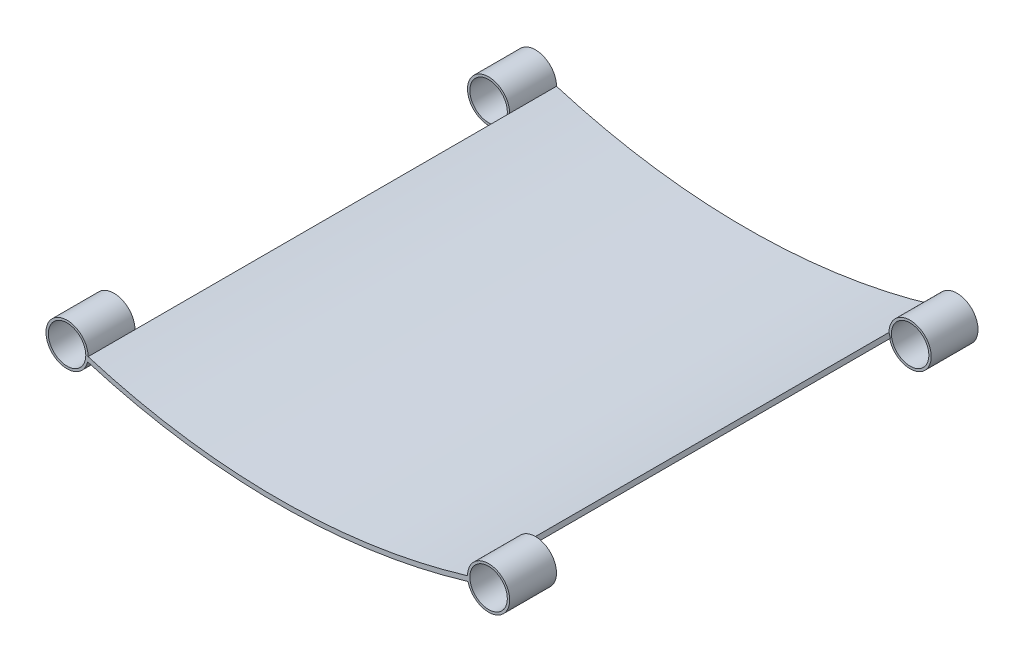
ISO-10303-21;
HEADER;
FILE_DESCRIPTION(('STEP AP214'),'2;1');
FILE_NAME('part.step','',(''),(''),'','','');
FILE_SCHEMA(('AUTOMOTIVE_DESIGN { 1 0 10303 214 1 1 1 1 }'));
ENDSEC;
DATA;
#1=APPLICATION_CONTEXT('core data for automotive mechanical design processes');
#2=APPLICATION_PROTOCOL_DEFINITION('international standard','automotive_design',2000,#1);
#3=PRODUCT_CONTEXT('',#1,'mechanical');
#4=PRODUCT('Part','Part','',(#3));
#5=PRODUCT_RELATED_PRODUCT_CATEGORY('part','',(#4));
#6=PRODUCT_DEFINITION_FORMATION('','',#4);
#7=PRODUCT_DEFINITION_CONTEXT('part definition',#1,'design');
#8=PRODUCT_DEFINITION('design','',#6,#7);
#9=PRODUCT_DEFINITION_SHAPE('','',#8);
#10=(LENGTH_UNIT() NAMED_UNIT(*) SI_UNIT(.MILLI.,.METRE.));
#11=(NAMED_UNIT(*) PLANE_ANGLE_UNIT() SI_UNIT($,.RADIAN.));
#12=(NAMED_UNIT(*) SI_UNIT($,.STERADIAN.) SOLID_ANGLE_UNIT());
#13=UNCERTAINTY_MEASURE_WITH_UNIT(LENGTH_MEASURE(1.E-05),#10,'distance_accuracy_value','');
#14=(GEOMETRIC_REPRESENTATION_CONTEXT(3) GLOBAL_UNCERTAINTY_ASSIGNED_CONTEXT((#13)) GLOBAL_UNIT_ASSIGNED_CONTEXT((#10,
#11,#12)) REPRESENTATION_CONTEXT('',''));
#15=CARTESIAN_POINT('',(0.,0.,0.));
#16=DIRECTION('',(0.,0.,1.));
#17=DIRECTION('',(1.,0.,0.));
#18=AXIS2_PLACEMENT_3D('',#15,#16,#17);
#19=CARTESIAN_POINT('',(40.5,0.,-100.));
#20=DIRECTION('',(-0.957242798620202,-0.289285714285659,0.));
#21=DIRECTION('',(0.289285714285659,-0.957242798620202,0.));
#22=AXIS2_PLACEMENT_3D('',#19,#20,#21);
#23=PLANE('',#22);
#24=DIRECTION('',(0.289285714285659,-0.957242798620202,0.));
#25=VECTOR('',#24,1.);
#26=CARTESIAN_POINT('',(40.5,0.,-90.));
#27=LINE('',#26,#25);
#28=CARTESIAN_POINT('',(40.5,0.,-90.));
#29=VERTEX_POINT('',#28);
#30=CARTESIAN_POINT('',(40.7892857142857,-0.957242798620195,-90.));
#31=VERTEX_POINT('',#30);
#32=EDGE_CURVE('E135',#29,#31,#27,.T.);
#33=ORIENTED_EDGE('',*,*,#32,.F.);
#34=DIRECTION('',(0.,0.,1.));
#35=VECTOR('',#34,1.);
#36=CARTESIAN_POINT('',(40.5,0.,-100.));
#37=LINE('',#36,#35);
#38=CARTESIAN_POINT('',(40.5,0.,-9.99999999999999));
#39=VERTEX_POINT('',#38);
#40=EDGE_CURVE('E120',#29,#39,#37,.T.);
#41=ORIENTED_EDGE('',*,*,#40,.T.);
#42=DIRECTION('',(-0.289285714285659,0.957242798620202,0.));
#43=VECTOR('',#42,1.);
#44=CARTESIAN_POINT('',(40.5,0.,-9.99999999999999));
#45=LINE('',#44,#43);
#46=CARTESIAN_POINT('',(40.7892857142857,-0.957242798620195,-9.99999999999999));
#47=VERTEX_POINT('',#46);
#48=EDGE_CURVE('E214',#47,#39,#45,.T.);
#49=ORIENTED_EDGE('',*,*,#48,.F.);
#50=DIRECTION('',(0.,0.,1.));
#51=VECTOR('',#50,1.);
#52=CARTESIAN_POINT('',(40.7892857142857,-0.957242798620195,-100.));
#53=LINE('',#52,#51);
#54=EDGE_CURVE('E136',#31,#47,#53,.T.);
#55=ORIENTED_EDGE('',*,*,#54,.F.);
#56=EDGE_LOOP('',(#33,#41,#49,#55));
#57=FACE_BOUND('',#56,.T.);
#58=ADVANCED_FACE('F45',(#57),#23,.F.);
#59=CARTESIAN_POINT('',(-40.5,0.,-100.));
#60=DIRECTION('',(-0.957242798620186,0.289285714285711,0.));
#61=DIRECTION('',(-0.289285714285711,-0.957242798620186,0.));
#62=AXIS2_PLACEMENT_3D('',#59,#60,#61);
#63=PLANE('',#62);
#64=DIRECTION('',(0.,0.,1.));
#65=VECTOR('',#64,1.);
#66=CARTESIAN_POINT('',(-40.4999999999999,0.,-100.));
#67=LINE('',#66,#65);
#68=CARTESIAN_POINT('',(-40.4999999999999,0.,-90.));
#69=VERTEX_POINT('',#68);
#70=CARTESIAN_POINT('',(-40.4999999999999,0.,-9.99999999999999));
#71=VERTEX_POINT('',#70);
#72=EDGE_CURVE('E238',#69,#71,#67,.T.);
#73=ORIENTED_EDGE('',*,*,#72,.F.);
#74=DIRECTION('',(-0.289285714285711,-0.957242798620186,0.));
#75=VECTOR('',#74,1.);
#76=CARTESIAN_POINT('',(-40.5,0.,-90.));
#77=LINE('',#76,#75);
#78=CARTESIAN_POINT('',(-40.7892857142857,-0.957242798620195,-90.));
#79=VERTEX_POINT('',#78);
#80=EDGE_CURVE('E190',#69,#79,#77,.T.);
#81=ORIENTED_EDGE('',*,*,#80,.T.);
#82=DIRECTION('',(0.,0.,1.));
#83=VECTOR('',#82,1.);
#84=CARTESIAN_POINT('',(-40.7892857142857,-0.957242798620195,-100.));
#85=LINE('',#84,#83);
#86=CARTESIAN_POINT('',(-40.7892857142857,-0.957242798620195,-10.));
#87=VERTEX_POINT('',#86);
#88=EDGE_CURVE('E237',#79,#87,#85,.T.);
#89=ORIENTED_EDGE('',*,*,#88,.T.);
#90=DIRECTION('',(-0.289285714285711,-0.957242798620186,0.));
#91=VECTOR('',#90,1.);
#92=CARTESIAN_POINT('',(-40.8765880102041,-1.24612500034662,-10.));
#93=LINE('',#92,#91);
#94=EDGE_CURVE('E243',#71,#87,#93,.T.);
#95=ORIENTED_EDGE('',*,*,#94,.F.);
#96=EDGE_LOOP('',(#73,#81,#89,#95));
#97=FACE_BOUND('',#96,.T.);
#98=ADVANCED_FACE('F292',(#97),#63,.T.);
#99=CARTESIAN_POINT('',(-45.,0.,-10.));
#100=DIRECTION('',(0.,0.,1.));
#101=DIRECTION('',(1.,0.,0.));
#102=AXIS2_PLACEMENT_3D('',#99,#100,#101);
#103=CYLINDRICAL_SURFACE('',#102,4.5);
#104=CARTESIAN_POINT('',(-45.,0.,-10.));
#105=DIRECTION('',(0.,0.,1.));
#106=DIRECTION('',(1.,0.,0.));
#107=AXIS2_PLACEMENT_3D('',#104,#105,#106);
#108=CIRCLE('',#107,4.5);
#109=CARTESIAN_POINT('',(-40.6147762521767,-1.00985775311525,-10.));
#110=VERTEX_POINT('',#109);
#111=EDGE_CURVE('E11',#71,#110,#108,.T.);
#112=ORIENTED_EDGE('',*,*,#111,.T.);
#113=DIRECTION('',(0.,0.,1.));
#114=VECTOR('',#113,1.);
#115=CARTESIAN_POINT('',(-40.6147762521767,-1.00985775311527,-50.));
#116=LINE('',#115,#114);
#117=CARTESIAN_POINT('',(-40.6147762521767,-1.00985775311527,0.));
#118=VERTEX_POINT('',#117);
#119=EDGE_CURVE('E251',#110,#118,#116,.T.);
#120=ORIENTED_EDGE('',*,*,#119,.T.);
#121=CARTESIAN_POINT('',(-45.,0.,0.));
#122=DIRECTION('',(0.,0.,1.));
#123=DIRECTION('',(1.,0.,0.));
#124=AXIS2_PLACEMENT_3D('',#121,#122,#123);
#125=CIRCLE('',#124,4.5);
#126=CARTESIAN_POINT('',(-40.4999999999999,0.,0.));
#127=VERTEX_POINT('',#126);
#128=EDGE_CURVE('E49',#127,#118,#125,.T.);
#129=ORIENTED_EDGE('',*,*,#128,.F.);
#130=EDGE_CURVE('E150',#71,#127,#67,.T.);
#131=ORIENTED_EDGE('',*,*,#130,.F.);
#132=EDGE_LOOP('',(#112,#120,#129,#131));
#133=FACE_BOUND('',#132,.T.);
#134=ADVANCED_FACE('F47',(#133),#103,.T.);
#135=CARTESIAN_POINT('',(-45.,0.,-10.));
#136=DIRECTION('',(0.,0.,1.));
#137=DIRECTION('',(1.,0.,0.));
#138=AXIS2_PLACEMENT_3D('',#135,#136,#137);
#139=PLANE('',#138);
#140=CARTESIAN_POINT('',(0.,134.013991806826,-9.99999999999999));
#141=DIRECTION('',(0.,0.,1.));
#142=DIRECTION('',(1.,0.,0.));
#143=AXIS2_PLACEMENT_3D('',#140,#141,#142);
#144=CIRCLE('',#143,141.);
#145=EDGE_CURVE('E247',#110,#87,#144,.F.);
#146=ORIENTED_EDGE('',*,*,#145,.F.);
#147=ORIENTED_EDGE('',*,*,#111,.F.);
#148=ORIENTED_EDGE('',*,*,#94,.T.);
#149=EDGE_LOOP('',(#146,#147,#148));
#150=FACE_BOUND('',#149,.T.);
#151=CARTESIAN_POINT('',(-45.,0.,-10.));
#152=DIRECTION('',(0.,0.,1.));
#153=DIRECTION('',(1.,0.,0.));
#154=AXIS2_PLACEMENT_3D('',#151,#152,#153);
#155=CIRCLE('',#154,4.);
#156=CARTESIAN_POINT('',(-41.,0.,-10.));
#157=VERTEX_POINT('',#156);
#158=EDGE_CURVE('E256',#157,#157,#155,.T.);
#159=ORIENTED_EDGE('',*,*,#158,.T.);
#160=EDGE_LOOP('',(#159));
#161=FACE_BOUND('',#160,.T.);
#162=ADVANCED_FACE('F269',(#150,#161),#139,.F.);
#163=CARTESIAN_POINT('',(-45.,0.,0.));
#164=DIRECTION('',(0.,0.,1.));
#165=DIRECTION('',(1.,0.,0.));
#166=AXIS2_PLACEMENT_3D('',#163,#164,#165);
#167=PLANE('',#166);
#168=CARTESIAN_POINT('',(0.,134.013991806826,0.));
#169=DIRECTION('',(0.,0.,-1.));
#170=DIRECTION('',(-1.,0.,0.));
#171=AXIS2_PLACEMENT_3D('',#168,#169,#170);
#172=CIRCLE('',#171,141.);
#173=CARTESIAN_POINT('',(40.6147762521768,-1.00985775311524,0.));
#174=VERTEX_POINT('',#173);
#175=EDGE_CURVE('E220',#174,#118,#172,.T.);
#176=ORIENTED_EDGE('',*,*,#175,.F.);
#177=CARTESIAN_POINT('',(45.,0.,0.));
#178=DIRECTION('',(0.,0.,1.));
#179=DIRECTION('',(1.,0.,0.));
#180=AXIS2_PLACEMENT_3D('',#177,#178,#179);
#181=CIRCLE('',#180,4.5);
#182=CARTESIAN_POINT('',(40.5,0.,0.));
#183=VERTEX_POINT('',#182);
#184=EDGE_CURVE('E195',#174,#183,#181,.T.);
#185=ORIENTED_EDGE('',*,*,#184,.T.);
#186=CARTESIAN_POINT('',(0.,134.013991806826,0.));
#187=DIRECTION('',(0.,0.,-1.));
#188=DIRECTION('',(-1.,0.,0.));
#189=AXIS2_PLACEMENT_3D('',#186,#187,#188);
#190=CIRCLE('',#189,140.);
#191=EDGE_CURVE('E225',#183,#127,#190,.T.);
#192=ORIENTED_EDGE('',*,*,#191,.T.);
#193=ORIENTED_EDGE('',*,*,#128,.T.);
#194=EDGE_LOOP('',(#176,#185,#192,#193));
#195=FACE_BOUND('',#194,.T.);
#196=CARTESIAN_POINT('',(-45.,0.,0.));
#197=DIRECTION('',(0.,0.,1.));
#198=DIRECTION('',(1.,0.,0.));
#199=AXIS2_PLACEMENT_3D('',#196,#197,#198);
#200=CIRCLE('',#199,4.);
#201=CARTESIAN_POINT('',(-41.,0.,0.));
#202=VERTEX_POINT('',#201);
#203=EDGE_CURVE('E255',#202,#202,#200,.T.);
#204=ORIENTED_EDGE('',*,*,#203,.F.);
#205=EDGE_LOOP('',(#204));
#206=FACE_BOUND('',#205,.T.);
#207=CARTESIAN_POINT('',(45.,0.,0.));
#208=DIRECTION('',(0.,0.,1.));
#209=DIRECTION('',(1.,0.,0.));
#210=AXIS2_PLACEMENT_3D('',#207,#208,#209);
#211=CIRCLE('',#210,4.);
#212=CARTESIAN_POINT('',(49.,0.,0.));
#213=VERTEX_POINT('',#212);
#214=EDGE_CURVE('E203',#213,#213,#211,.T.);
#215=ORIENTED_EDGE('',*,*,#214,.F.);
#216=EDGE_LOOP('',(#215));
#217=FACE_BOUND('',#216,.T.);
#218=ADVANCED_FACE('F266',(#195,#206,#217),#167,.T.);
#219=CARTESIAN_POINT('',(-45.,0.,-10.));
#220=DIRECTION('',(0.,0.,1.));
#221=DIRECTION('',(1.,0.,0.));
#222=AXIS2_PLACEMENT_3D('',#219,#220,#221);
#223=CYLINDRICAL_SURFACE('',#222,4.);
#224=ORIENTED_EDGE('',*,*,#158,.F.);
#225=EDGE_LOOP('',(#224));
#226=FACE_BOUND('',#225,.T.);
#227=ORIENTED_EDGE('',*,*,#203,.T.);
#228=EDGE_LOOP('',(#227));
#229=FACE_BOUND('',#228,.T.);
#230=ADVANCED_FACE('F264',(#226,#229),#223,.F.);
#231=CARTESIAN_POINT('',(0.,134.013991806826,-100.));
#232=DIRECTION('',(0.,0.,1.));
#233=DIRECTION('',(1.,0.,0.));
#234=AXIS2_PLACEMENT_3D('',#231,#232,#233);
#235=CYLINDRICAL_SURFACE('',#234,141.);
#236=CARTESIAN_POINT('',(0.,134.013991806826,-100.));
#237=DIRECTION('',(0.,0.,-1.));
#238=DIRECTION('',(-1.,0.,0.));
#239=AXIS2_PLACEMENT_3D('',#236,#237,#238);
#240=CIRCLE('',#239,141.);
#241=CARTESIAN_POINT('',(40.6147762521769,-1.00985775311521,-100.));
#242=VERTEX_POINT('',#241);
#243=CARTESIAN_POINT('',(-40.6147762521767,-1.00985775311524,-100.));
#244=VERTEX_POINT('',#243);
#245=EDGE_CURVE('E221',#242,#244,#240,.T.);
#246=ORIENTED_EDGE('',*,*,#245,.F.);
#247=DIRECTION('',(0.,0.,-1.));
#248=VECTOR('',#247,1.);
#249=CARTESIAN_POINT('',(40.6147762521767,-1.00985775311524,-95.));
#250=LINE('',#249,#248);
#251=CARTESIAN_POINT('',(40.6147762521767,-1.00985775311525,-90.));
#252=VERTEX_POINT('',#251);
#253=EDGE_CURVE('E61',#242,#252,#250,.F.);
#254=ORIENTED_EDGE('',*,*,#253,.T.);
#255=CARTESIAN_POINT('',(0.,134.013991806826,-90.));
#256=DIRECTION('',(0.,0.,-1.));
#257=DIRECTION('',(-1.,0.,0.));
#258=AXIS2_PLACEMENT_3D('',#255,#256,#257);
#259=CIRCLE('',#258,141.);
#260=EDGE_CURVE('E65',#31,#252,#259,.T.);
#261=ORIENTED_EDGE('',*,*,#260,.F.);
#262=ORIENTED_EDGE('',*,*,#54,.T.);
#263=CARTESIAN_POINT('',(0.,134.013991806826,-9.99999999999999));
#264=DIRECTION('',(0.,0.,1.));
#265=DIRECTION('',(1.,0.,0.));
#266=AXIS2_PLACEMENT_3D('',#263,#264,#265);
#267=CIRCLE('',#266,141.);
#268=CARTESIAN_POINT('',(40.6147762521767,-1.00985775311525,-10.));
#269=VERTEX_POINT('',#268);
#270=EDGE_CURVE('E207',#269,#47,#267,.T.);
#271=ORIENTED_EDGE('',*,*,#270,.F.);
#272=DIRECTION('',(0.,0.,1.));
#273=VECTOR('',#272,1.);
#274=CARTESIAN_POINT('',(40.6147762521767,-1.00985775311524,-5.));
#275=LINE('',#274,#273);
#276=EDGE_CURVE('E217',#269,#174,#275,.T.);
#277=ORIENTED_EDGE('',*,*,#276,.T.);
#278=ORIENTED_EDGE('',*,*,#175,.T.);
#279=ORIENTED_EDGE('',*,*,#119,.F.);
#280=ORIENTED_EDGE('',*,*,#145,.T.);
#281=ORIENTED_EDGE('',*,*,#88,.F.);
#282=CARTESIAN_POINT('',(0.,134.013991806826,-90.));
#283=DIRECTION('',(0.,0.,-1.));
#284=DIRECTION('',(-1.,0.,0.));
#285=AXIS2_PLACEMENT_3D('',#282,#283,#284);
#286=CIRCLE('',#285,141.);
#287=CARTESIAN_POINT('',(-40.6147762521767,-1.00985775311525,-90.));
#288=VERTEX_POINT('',#287);
#289=EDGE_CURVE('E187',#288,#79,#286,.T.);
#290=ORIENTED_EDGE('',*,*,#289,.F.);
#291=DIRECTION('',(0.,0.,-1.));
#292=VECTOR('',#291,1.);
#293=CARTESIAN_POINT('',(-40.6147762521767,-1.00985775311524,-95.));
#294=LINE('',#293,#292);
#295=EDGE_CURVE('E180',#288,#244,#294,.T.);
#296=ORIENTED_EDGE('',*,*,#295,.T.);
#297=EDGE_LOOP('',(#246,#254,#261,#262,#271,#277,#278,#279,#280,#281,#290,#296));
#298=FACE_BOUND('',#297,.T.);
#299=ADVANCED_FACE('F301',(#298),#235,.T.);
#300=CARTESIAN_POINT('',(0.,134.013991806826,-100.));
#301=DIRECTION('',(0.,0.,1.));
#302=DIRECTION('',(1.,0.,0.));
#303=AXIS2_PLACEMENT_3D('',#300,#301,#302);
#304=CYLINDRICAL_SURFACE('',#303,140.);
#305=ORIENTED_EDGE('',*,*,#191,.F.);
#306=EDGE_CURVE('E128',#39,#183,#37,.T.);
#307=ORIENTED_EDGE('',*,*,#306,.F.);
#308=ORIENTED_EDGE('',*,*,#40,.F.);
#309=CARTESIAN_POINT('',(40.5,0.,-100.));
#310=VERTEX_POINT('',#309);
#311=EDGE_CURVE('E125',#310,#29,#37,.T.);
#312=ORIENTED_EDGE('',*,*,#311,.F.);
#313=CARTESIAN_POINT('',(0.,134.013991806826,-100.));
#314=DIRECTION('',(0.,0.,-1.));
#315=DIRECTION('',(-1.,0.,0.));
#316=AXIS2_PLACEMENT_3D('',#313,#314,#315);
#317=CIRCLE('',#316,140.);
#318=CARTESIAN_POINT('',(-40.5,0.,-100.));
#319=VERTEX_POINT('',#318);
#320=EDGE_CURVE('E224',#310,#319,#317,.T.);
#321=ORIENTED_EDGE('',*,*,#320,.T.);
#322=EDGE_CURVE('E233',#319,#69,#67,.T.);
#323=ORIENTED_EDGE('',*,*,#322,.T.);
#324=ORIENTED_EDGE('',*,*,#72,.T.);
#325=ORIENTED_EDGE('',*,*,#130,.T.);
#326=EDGE_LOOP('',(#305,#307,#308,#312,#321,#323,#324,#325));
#327=FACE_BOUND('',#326,.T.);
#328=ADVANCED_FACE('F122',(#327),#304,.F.);
#329=CARTESIAN_POINT('',(0.,134.013991806826,-100.));
#330=DIRECTION('',(0.,0.,-1.));
#331=DIRECTION('',(-1.,0.,0.));
#332=AXIS2_PLACEMENT_3D('',#329,#330,#331);
#333=PLANE('',#332);
#334=ORIENTED_EDGE('',*,*,#320,.F.);
#335=CARTESIAN_POINT('',(45.,0.,-100.));
#336=DIRECTION('',(0.,0.,-1.));
#337=DIRECTION('',(-1.,0.,0.));
#338=AXIS2_PLACEMENT_3D('',#335,#336,#337);
#339=CIRCLE('',#338,4.5);
#340=EDGE_CURVE('E148',#310,#242,#339,.T.);
#341=ORIENTED_EDGE('',*,*,#340,.T.);
#342=ORIENTED_EDGE('',*,*,#245,.T.);
#343=CARTESIAN_POINT('',(-45.,0.,-100.));
#344=DIRECTION('',(0.,0.,-1.));
#345=DIRECTION('',(-1.,0.,0.));
#346=AXIS2_PLACEMENT_3D('',#343,#344,#345);
#347=CIRCLE('',#346,4.5);
#348=EDGE_CURVE('E173',#244,#319,#347,.T.);
#349=ORIENTED_EDGE('',*,*,#348,.T.);
#350=EDGE_LOOP('',(#334,#341,#342,#349));
#351=FACE_BOUND('',#350,.T.);
#352=CARTESIAN_POINT('',(-45.,0.,-100.));
#353=DIRECTION('',(0.,0.,-1.));
#354=DIRECTION('',(-1.,0.,0.));
#355=AXIS2_PLACEMENT_3D('',#352,#353,#354);
#356=CIRCLE('',#355,4.);
#357=CARTESIAN_POINT('',(-49.,0.,-100.));
#358=VERTEX_POINT('',#357);
#359=EDGE_CURVE('E140',#358,#358,#356,.T.);
#360=ORIENTED_EDGE('',*,*,#359,.F.);
#361=EDGE_LOOP('',(#360));
#362=FACE_BOUND('',#361,.T.);
#363=CARTESIAN_POINT('',(45.,0.,-100.));
#364=DIRECTION('',(0.,0.,-1.));
#365=DIRECTION('',(-1.,0.,0.));
#366=AXIS2_PLACEMENT_3D('',#363,#364,#365);
#367=CIRCLE('',#366,4.);
#368=CARTESIAN_POINT('',(41.,0.,-100.));
#369=VERTEX_POINT('',#368);
#370=EDGE_CURVE('E158',#369,#369,#367,.T.);
#371=ORIENTED_EDGE('',*,*,#370,.F.);
#372=EDGE_LOOP('',(#371));
#373=FACE_BOUND('',#372,.T.);
#374=ADVANCED_FACE('F330',(#351,#362,#373),#333,.T.);
#375=CARTESIAN_POINT('',(45.,0.,-10.));
#376=DIRECTION('',(0.,0.,1.));
#377=DIRECTION('',(1.,0.,0.));
#378=AXIS2_PLACEMENT_3D('',#375,#376,#377);
#379=CYLINDRICAL_SURFACE('',#378,4.5);
#380=ORIENTED_EDGE('',*,*,#276,.F.);
#381=CARTESIAN_POINT('',(45.,0.,-10.));
#382=DIRECTION('',(0.,0.,1.));
#383=DIRECTION('',(1.,0.,0.));
#384=AXIS2_PLACEMENT_3D('',#381,#382,#383);
#385=CIRCLE('',#384,4.5);
#386=EDGE_CURVE('E194',#269,#39,#385,.T.);
#387=ORIENTED_EDGE('',*,*,#386,.T.);
#388=ORIENTED_EDGE('',*,*,#306,.T.);
#389=ORIENTED_EDGE('',*,*,#184,.F.);
#390=EDGE_LOOP('',(#380,#387,#388,#389));
#391=FACE_BOUND('',#390,.T.);
#392=ADVANCED_FACE('F286',(#391),#379,.T.);
#393=CARTESIAN_POINT('',(45.,0.,-10.));
#394=DIRECTION('',(0.,0.,1.));
#395=DIRECTION('',(1.,0.,0.));
#396=AXIS2_PLACEMENT_3D('',#393,#394,#395);
#397=PLANE('',#396);
#398=CARTESIAN_POINT('',(45.,0.,-10.));
#399=DIRECTION('',(0.,0.,1.));
#400=DIRECTION('',(1.,0.,0.));
#401=AXIS2_PLACEMENT_3D('',#398,#399,#400);
#402=CIRCLE('',#401,4.);
#403=CARTESIAN_POINT('',(49.,0.,-10.));
#404=VERTEX_POINT('',#403);
#405=EDGE_CURVE('E199',#404,#404,#402,.T.);
#406=ORIENTED_EDGE('',*,*,#405,.T.);
#407=EDGE_LOOP('',(#406));
#408=FACE_BOUND('',#407,.T.);
#409=ORIENTED_EDGE('',*,*,#270,.T.);
#410=ORIENTED_EDGE('',*,*,#48,.T.);
#411=ORIENTED_EDGE('',*,*,#386,.F.);
#412=EDGE_LOOP('',(#409,#410,#411));
#413=FACE_BOUND('',#412,.T.);
#414=ADVANCED_FACE('F276',(#408,#413),#397,.F.);
#415=CARTESIAN_POINT('',(45.,0.,-10.));
#416=DIRECTION('',(0.,0.,1.));
#417=DIRECTION('',(1.,0.,0.));
#418=AXIS2_PLACEMENT_3D('',#415,#416,#417);
#419=CYLINDRICAL_SURFACE('',#418,4.);
#420=ORIENTED_EDGE('',*,*,#405,.F.);
#421=EDGE_LOOP('',(#420));
#422=FACE_BOUND('',#421,.T.);
#423=ORIENTED_EDGE('',*,*,#214,.T.);
#424=EDGE_LOOP('',(#423));
#425=FACE_BOUND('',#424,.T.);
#426=ADVANCED_FACE('F273',(#422,#425),#419,.F.);
#427=CARTESIAN_POINT('',(-45.,0.,-90.));
#428=DIRECTION('',(0.,0.,-1.));
#429=DIRECTION('',(-1.,0.,0.));
#430=AXIS2_PLACEMENT_3D('',#427,#428,#429);
#431=PLANE('',#430);
#432=CARTESIAN_POINT('',(-45.,0.,-90.));
#433=DIRECTION('',(0.,0.,-1.));
#434=DIRECTION('',(-1.,0.,0.));
#435=AXIS2_PLACEMENT_3D('',#432,#433,#434);
#436=CIRCLE('',#435,4.);
#437=CARTESIAN_POINT('',(-49.,0.,-90.));
#438=VERTEX_POINT('',#437);
#439=EDGE_CURVE('E169',#438,#438,#436,.T.);
#440=ORIENTED_EDGE('',*,*,#439,.T.);
#441=EDGE_LOOP('',(#440));
#442=FACE_BOUND('',#441,.T.);
#443=ORIENTED_EDGE('',*,*,#80,.F.);
#444=CARTESIAN_POINT('',(-45.,0.,-90.));
#445=DIRECTION('',(0.,0.,-1.));
#446=DIRECTION('',(-1.,0.,0.));
#447=AXIS2_PLACEMENT_3D('',#444,#445,#446);
#448=CIRCLE('',#447,4.5);
#449=EDGE_CURVE('E177',#288,#69,#448,.T.);
#450=ORIENTED_EDGE('',*,*,#449,.F.);
#451=ORIENTED_EDGE('',*,*,#289,.T.);
#452=EDGE_LOOP('',(#443,#450,#451));
#453=FACE_BOUND('',#452,.T.);
#454=ADVANCED_FACE('F275',(#442,#453),#431,.F.);
#455=CARTESIAN_POINT('',(-45.,0.,-90.));
#456=DIRECTION('',(0.,0.,-1.));
#457=DIRECTION('',(-1.,0.,0.));
#458=AXIS2_PLACEMENT_3D('',#455,#456,#457);
#459=CYLINDRICAL_SURFACE('',#458,4.5);
#460=ORIENTED_EDGE('',*,*,#295,.F.);
#461=ORIENTED_EDGE('',*,*,#449,.T.);
#462=ORIENTED_EDGE('',*,*,#322,.F.);
#463=ORIENTED_EDGE('',*,*,#348,.F.);
#464=EDGE_LOOP('',(#460,#461,#462,#463));
#465=FACE_BOUND('',#464,.T.);
#466=ADVANCED_FACE('F283',(#465),#459,.T.);
#467=CARTESIAN_POINT('',(-45.,0.,-90.));
#468=DIRECTION('',(0.,0.,-1.));
#469=DIRECTION('',(-1.,0.,0.));
#470=AXIS2_PLACEMENT_3D('',#467,#468,#469);
#471=CYLINDRICAL_SURFACE('',#470,4.);
#472=ORIENTED_EDGE('',*,*,#439,.F.);
#473=EDGE_LOOP('',(#472));
#474=FACE_BOUND('',#473,.T.);
#475=ORIENTED_EDGE('',*,*,#359,.T.);
#476=EDGE_LOOP('',(#475));
#477=FACE_BOUND('',#476,.T.);
#478=ADVANCED_FACE('F349',(#474,#477),#471,.F.);
#479=CARTESIAN_POINT('',(45.,0.,-90.));
#480=DIRECTION('',(0.,0.,-1.));
#481=DIRECTION('',(-1.,0.,0.));
#482=AXIS2_PLACEMENT_3D('',#479,#480,#481);
#483=CYLINDRICAL_SURFACE('',#482,4.5);
#484=ORIENTED_EDGE('',*,*,#253,.F.);
#485=ORIENTED_EDGE('',*,*,#340,.F.);
#486=ORIENTED_EDGE('',*,*,#311,.T.);
#487=CARTESIAN_POINT('',(45.,0.,-90.));
#488=DIRECTION('',(0.,0.,-1.));
#489=DIRECTION('',(-1.,0.,0.));
#490=AXIS2_PLACEMENT_3D('',#487,#488,#489);
#491=CIRCLE('',#490,4.5);
#492=EDGE_CURVE('E146',#29,#252,#491,.T.);
#493=ORIENTED_EDGE('',*,*,#492,.T.);
#494=EDGE_LOOP('',(#484,#485,#486,#493));
#495=FACE_BOUND('',#494,.T.);
#496=ADVANCED_FACE('F145',(#495),#483,.T.);
#497=CARTESIAN_POINT('',(45.,0.,-90.));
#498=DIRECTION('',(0.,0.,-1.));
#499=DIRECTION('',(-1.,0.,0.));
#500=AXIS2_PLACEMENT_3D('',#497,#498,#499);
#501=PLANE('',#500);
#502=CARTESIAN_POINT('',(45.,0.,-90.));
#503=DIRECTION('',(0.,0.,-1.));
#504=DIRECTION('',(-1.,0.,0.));
#505=AXIS2_PLACEMENT_3D('',#502,#503,#504);
#506=CIRCLE('',#505,4.);
#507=CARTESIAN_POINT('',(41.,0.,-90.));
#508=VERTEX_POINT('',#507);
#509=EDGE_CURVE('E155',#508,#508,#506,.T.);
#510=ORIENTED_EDGE('',*,*,#509,.T.);
#511=EDGE_LOOP('',(#510));
#512=FACE_BOUND('',#511,.T.);
#513=ORIENTED_EDGE('',*,*,#492,.F.);
#514=ORIENTED_EDGE('',*,*,#32,.T.);
#515=ORIENTED_EDGE('',*,*,#260,.T.);
#516=EDGE_LOOP('',(#513,#514,#515));
#517=FACE_BOUND('',#516,.T.);
#518=ADVANCED_FACE('F151',(#512,#517),#501,.F.);
#519=CARTESIAN_POINT('',(45.,0.,-90.));
#520=DIRECTION('',(0.,0.,-1.));
#521=DIRECTION('',(-1.,0.,0.));
#522=AXIS2_PLACEMENT_3D('',#519,#520,#521);
#523=CYLINDRICAL_SURFACE('',#522,4.);
#524=ORIENTED_EDGE('',*,*,#509,.F.);
#525=EDGE_LOOP('',(#524));
#526=FACE_BOUND('',#525,.T.);
#527=ORIENTED_EDGE('',*,*,#370,.T.);
#528=EDGE_LOOP('',(#527));
#529=FACE_BOUND('',#528,.T.);
#530=ADVANCED_FACE('F337',(#526,#529),#523,.F.);
#531=CLOSED_SHELL('',(#58,#98,#134,#162,#218,#230,#299,#328,#374,#392,#414,#426,#454,#466,#478,
#496,#518,#530));
#532=MANIFOLD_SOLID_BREP('B2',#531);
#533=ADVANCED_BREP_SHAPE_REPRESENTATION('',(#18,#532),#14);
#534=SHAPE_DEFINITION_REPRESENTATION(#9,#533);
ENDSEC;
END-ISO-10303-21;
